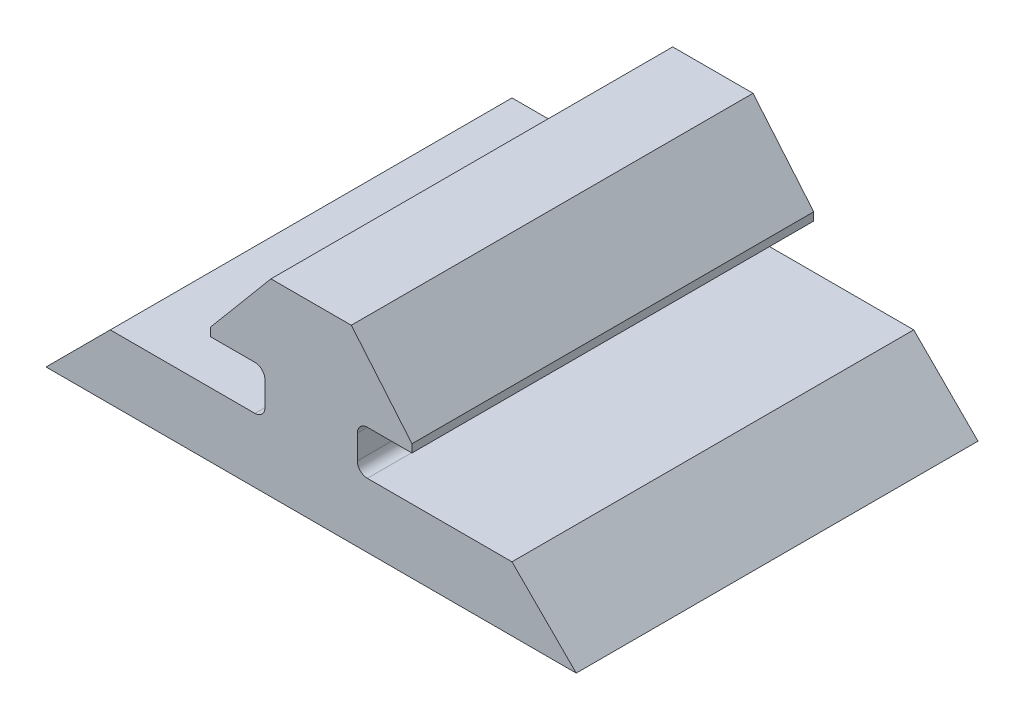
ISO-10303-21;
HEADER;
FILE_DESCRIPTION(('STEP AP214'),'2;1');
FILE_NAME('part.step','',(''),(''),'','','');
FILE_SCHEMA(('AUTOMOTIVE_DESIGN { 1 0 10303 214 1 1 1 1 }'));
ENDSEC;
DATA;
#1=APPLICATION_CONTEXT('core data for automotive mechanical design processes');
#2=APPLICATION_PROTOCOL_DEFINITION('international standard','automotive_design',2000,#1);
#3=PRODUCT_CONTEXT('',#1,'mechanical');
#4=PRODUCT('Part','Part','',(#3));
#5=PRODUCT_RELATED_PRODUCT_CATEGORY('part','',(#4));
#6=PRODUCT_DEFINITION_FORMATION('','',#4);
#7=PRODUCT_DEFINITION_CONTEXT('part definition',#1,'design');
#8=PRODUCT_DEFINITION('design','',#6,#7);
#9=PRODUCT_DEFINITION_SHAPE('','',#8);
#10=(LENGTH_UNIT() NAMED_UNIT(*) SI_UNIT(.MILLI.,.METRE.));
#11=(NAMED_UNIT(*) PLANE_ANGLE_UNIT() SI_UNIT($,.RADIAN.));
#12=(NAMED_UNIT(*) SI_UNIT($,.STERADIAN.) SOLID_ANGLE_UNIT());
#13=UNCERTAINTY_MEASURE_WITH_UNIT(LENGTH_MEASURE(1.E-05),#10,'distance_accuracy_value','');
#14=(GEOMETRIC_REPRESENTATION_CONTEXT(3) GLOBAL_UNCERTAINTY_ASSIGNED_CONTEXT((#13)) GLOBAL_UNIT_ASSIGNED_CONTEXT((#10,
#11,#12)) REPRESENTATION_CONTEXT('',''));
#15=CARTESIAN_POINT('',(0.,0.,0.));
#16=DIRECTION('',(0.,0.,1.));
#17=DIRECTION('',(1.,0.,0.));
#18=AXIS2_PLACEMENT_3D('',#15,#16,#17);
#19=CARTESIAN_POINT('',(12.7,4.064,-3683.));
#20=DIRECTION('',(0.,1.,0.));
#21=DIRECTION('',(0.,0.,1.));
#22=AXIS2_PLACEMENT_3D('',#19,#20,#21);
#23=PLANE('',#22);
#24=DIRECTION('',(1.,0.,0.));
#25=VECTOR('',#24,1.);
#26=CARTESIAN_POINT('',(12.7,4.064,-25.4031625000231));
#27=LINE('',#26,#25);
#28=CARTESIAN_POINT('',(3.556,4.064,-25.4031625000231));
#29=VERTEX_POINT('',#28);
#30=CARTESIAN_POINT('',(12.7,4.064,-25.4031625000229));
#31=VERTEX_POINT('',#30);
#32=EDGE_CURVE('E171',#29,#31,#27,.T.);
#33=ORIENTED_EDGE('',*,*,#32,.F.);
#34=DIRECTION('',(0.,0.,1.));
#35=VECTOR('',#34,1.);
#36=CARTESIAN_POINT('',(3.556,4.064,-3683.));
#37=LINE('',#36,#35);
#38=CARTESIAN_POINT('',(3.556,4.064,0.));
#39=VERTEX_POINT('',#38);
#40=EDGE_CURVE('E46',#29,#39,#37,.T.);
#41=ORIENTED_EDGE('',*,*,#40,.T.);
#42=DIRECTION('',(-1.,0.,0.));
#43=VECTOR('',#42,1.);
#44=CARTESIAN_POINT('',(12.7,4.064,0.));
#45=LINE('',#44,#43);
#46=CARTESIAN_POINT('',(12.7,4.064,0.));
#47=VERTEX_POINT('',#46);
#48=EDGE_CURVE('E53',#47,#39,#45,.T.);
#49=ORIENTED_EDGE('',*,*,#48,.F.);
#50=DIRECTION('',(0.,0.,1.));
#51=VECTOR('',#50,1.);
#52=CARTESIAN_POINT('',(12.7,4.064,-50.8000250000002));
#53=LINE('',#52,#51);
#54=EDGE_CURVE('E193',#31,#47,#53,.T.);
#55=ORIENTED_EDGE('',*,*,#54,.F.);
#56=EDGE_LOOP('',(#33,#41,#49,#55));
#57=FACE_BOUND('',#56,.T.);
#58=ADVANCED_FACE('F43',(#57),#23,.T.);
#59=CARTESIAN_POINT('',(3.55599999999985,4.69899999999985,-3683.));
#60=DIRECTION('',(0.,0.,-1.));
#61=DIRECTION('',(0.707106781186462,0.707106781186633,0.));
#62=AXIS2_PLACEMENT_3D('',#59,#60,#61);
#63=CYLINDRICAL_SURFACE('',#62,0.634999999999855);
#64=ORIENTED_EDGE('',*,*,#40,.F.);
#65=CARTESIAN_POINT('',(3.55599999999985,4.69899999999985,-25.4031625000231));
#66=DIRECTION('',(0.,0.,1.));
#67=DIRECTION('',(1.,0.,0.));
#68=AXIS2_PLACEMENT_3D('',#65,#66,#67);
#69=CIRCLE('',#68,0.634999999999855);
#70=CARTESIAN_POINT('',(2.921,4.69899999999985,-25.4031625000231));
#71=VERTEX_POINT('',#70);
#72=EDGE_CURVE('E471',#29,#71,#69,.F.);
#73=ORIENTED_EDGE('',*,*,#72,.T.);
#74=DIRECTION('',(0.,0.,1.));
#75=VECTOR('',#74,1.);
#76=CARTESIAN_POINT('',(2.921,4.69899999999985,-3683.));
#77=LINE('',#76,#75);
#78=CARTESIAN_POINT('',(2.921,4.69899999999985,0.));
#79=VERTEX_POINT('',#78);
#80=EDGE_CURVE('E272',#71,#79,#77,.T.);
#81=ORIENTED_EDGE('',*,*,#80,.T.);
#82=CARTESIAN_POINT('',(3.55599999999985,4.69899999999985,0.));
#83=DIRECTION('',(0.,0.,1.));
#84=DIRECTION('',(1.,0.,0.));
#85=AXIS2_PLACEMENT_3D('',#82,#83,#84);
#86=CIRCLE('',#85,0.634999999999855);
#87=EDGE_CURVE('E274',#79,#39,#86,.T.);
#88=ORIENTED_EDGE('',*,*,#87,.T.);
#89=EDGE_LOOP('',(#64,#73,#81,#88));
#90=FACE_BOUND('',#89,.T.);
#91=ADVANCED_FACE('F539',(#90),#63,.F.);
#92=CARTESIAN_POINT('',(-12.7,0.,-3683.));
#93=DIRECTION('',(0.,-1.,0.));
#94=DIRECTION('',(0.,0.,-1.));
#95=AXIS2_PLACEMENT_3D('',#92,#93,#94);
#96=PLANE('',#95);
#97=DIRECTION('',(-1.,0.,0.));
#98=VECTOR('',#97,1.);
#99=CARTESIAN_POINT('',(-12.7,0.,-25.4031625000231));
#100=LINE('',#99,#98);
#101=CARTESIAN_POINT('',(16.7640000000001,0.,-25.4031625000229));
#102=VERTEX_POINT('',#101);
#103=CARTESIAN_POINT('',(-16.7639999999999,0.,-25.4031625000229));
#104=VERTEX_POINT('',#103);
#105=EDGE_CURVE('E60',#102,#104,#100,.T.);
#106=ORIENTED_EDGE('',*,*,#105,.F.);
#107=DIRECTION('',(0.,0.,1.));
#108=VECTOR('',#107,1.);
#109=CARTESIAN_POINT('',(16.7640000000001,0.,-50.8000250000002));
#110=LINE('',#109,#108);
#111=CARTESIAN_POINT('',(16.7640000000001,0.,0.));
#112=VERTEX_POINT('',#111);
#113=EDGE_CURVE('E182',#102,#112,#110,.T.);
#114=ORIENTED_EDGE('',*,*,#113,.T.);
#115=DIRECTION('',(1.,0.,0.));
#116=VECTOR('',#115,1.);
#117=CARTESIAN_POINT('',(-12.7,0.,0.));
#118=LINE('',#117,#116);
#119=CARTESIAN_POINT('',(-16.7639999999999,0.,0.));
#120=VERTEX_POINT('',#119);
#121=EDGE_CURVE('E263',#120,#112,#118,.T.);
#122=ORIENTED_EDGE('',*,*,#121,.F.);
#123=DIRECTION('',(0.,0.,1.));
#124=VECTOR('',#123,1.);
#125=CARTESIAN_POINT('',(-16.7639999999999,0.,-50.8063250000458));
#126=LINE('',#125,#124);
#127=EDGE_CURVE('E184',#104,#120,#126,.T.);
#128=ORIENTED_EDGE('',*,*,#127,.F.);
#129=EDGE_LOOP('',(#106,#114,#122,#128));
#130=FACE_BOUND('',#129,.T.);
#131=ADVANCED_FACE('F180',(#130),#96,.T.);
#132=CARTESIAN_POINT('',(3.55599999999985,4.69899999999985,0.));
#133=DIRECTION('',(0.,0.,1.));
#134=DIRECTION('',(1.,0.,0.));
#135=AXIS2_PLACEMENT_3D('',#132,#133,#134);
#136=PLANE('',#135);
#137=ORIENTED_EDGE('',*,*,#121,.T.);
#138=DIRECTION('',(-0.707106781186556,0.707106781186539,0.));
#139=VECTOR('',#138,1.);
#140=CARTESIAN_POINT('',(12.7,4.064,0.));
#141=LINE('',#140,#139);
#142=EDGE_CURVE('E191',#112,#47,#141,.T.);
#143=ORIENTED_EDGE('',*,*,#142,.T.);
#144=ORIENTED_EDGE('',*,*,#48,.T.);
#145=ORIENTED_EDGE('',*,*,#87,.F.);
#146=DIRECTION('',(0.,1.,0.));
#147=VECTOR('',#146,1.);
#148=CARTESIAN_POINT('',(2.921,4.699,0.));
#149=LINE('',#148,#147);
#150=CARTESIAN_POINT('',(2.921,6.223,0.));
#151=VERTEX_POINT('',#150);
#152=EDGE_CURVE('E403',#79,#151,#149,.T.);
#153=ORIENTED_EDGE('',*,*,#152,.T.);
#154=CARTESIAN_POINT('',(3.55599999999985,6.22300000000015,0.));
#155=DIRECTION('',(0.,0.,1.));
#156=DIRECTION('',(1.,0.,0.));
#157=AXIS2_PLACEMENT_3D('',#154,#155,#156);
#158=CIRCLE('',#157,0.634999999999855);
#159=CARTESIAN_POINT('',(3.55599999999985,6.858,0.));
#160=VERTEX_POINT('',#159);
#161=EDGE_CURVE('E397',#160,#151,#158,.T.);
#162=ORIENTED_EDGE('',*,*,#161,.F.);
#163=DIRECTION('',(1.,0.,0.));
#164=VECTOR('',#163,1.);
#165=CARTESIAN_POINT('',(3.556,6.858,0.));
#166=LINE('',#165,#164);
#167=CARTESIAN_POINT('',(6.376363549,6.858,0.));
#168=VERTEX_POINT('',#167);
#169=EDGE_CURVE('E391',#160,#168,#166,.T.);
#170=ORIENTED_EDGE('',*,*,#169,.T.);
#171=DIRECTION('',(0.,1.,0.));
#172=VECTOR('',#171,1.);
#173=CARTESIAN_POINT('',(6.376363549,6.858,0.));
#174=LINE('',#173,#172);
#175=CARTESIAN_POINT('',(6.376363549,7.36599995798179,0.));
#176=VERTEX_POINT('',#175);
#177=EDGE_CURVE('E385',#168,#176,#174,.T.);
#178=ORIENTED_EDGE('',*,*,#177,.T.);
#179=DIRECTION('',(-0.642787609686541,0.766044443118976,0.));
#180=VECTOR('',#179,1.);
#181=CARTESIAN_POINT('',(6.376363549,7.36599995798179,0.));
#182=LINE('',#181,#180);
#183=CARTESIAN_POINT('',(2.54,11.938,0.));
#184=VERTEX_POINT('',#183);
#185=EDGE_CURVE('E379',#176,#184,#182,.T.);
#186=ORIENTED_EDGE('',*,*,#185,.T.);
#187=DIRECTION('',(-1.,0.,0.));
#188=VECTOR('',#187,1.);
#189=CARTESIAN_POINT('',(2.54,11.938,0.));
#190=LINE('',#189,#188);
#191=CARTESIAN_POINT('',(-2.54,11.938,0.));
#192=VERTEX_POINT('',#191);
#193=EDGE_CURVE('E374',#184,#192,#190,.T.);
#194=ORIENTED_EDGE('',*,*,#193,.T.);
#195=DIRECTION('',(-0.642787609686541,-0.766044443118976,0.));
#196=VECTOR('',#195,1.);
#197=CARTESIAN_POINT('',(-2.54,11.938,0.));
#198=LINE('',#197,#196);
#199=CARTESIAN_POINT('',(-6.376363549,7.36599995798179,0.));
#200=VERTEX_POINT('',#199);
#201=EDGE_CURVE('E355',#192,#200,#198,.T.);
#202=ORIENTED_EDGE('',*,*,#201,.T.);
#203=DIRECTION('',(0.,-1.,0.));
#204=VECTOR('',#203,1.);
#205=CARTESIAN_POINT('',(-6.376363549,7.36599995798179,0.));
#206=LINE('',#205,#204);
#207=CARTESIAN_POINT('',(-6.376363549,6.858,0.));
#208=VERTEX_POINT('',#207);
#209=EDGE_CURVE('E348',#200,#208,#206,.T.);
#210=ORIENTED_EDGE('',*,*,#209,.T.);
#211=DIRECTION('',(1.,0.,0.));
#212=VECTOR('',#211,1.);
#213=CARTESIAN_POINT('',(-6.376363549,6.858,0.));
#214=LINE('',#213,#212);
#215=CARTESIAN_POINT('',(-3.556,6.858,0.));
#216=VERTEX_POINT('',#215);
#217=EDGE_CURVE('E352',#208,#216,#214,.T.);
#218=ORIENTED_EDGE('',*,*,#217,.T.);
#219=CARTESIAN_POINT('',(-3.55599999999985,6.22300000000015,0.));
#220=DIRECTION('',(0.,0.,1.));
#221=DIRECTION('',(1.,0.,0.));
#222=AXIS2_PLACEMENT_3D('',#219,#220,#221);
#223=CIRCLE('',#222,0.634999999999855);
#224=CARTESIAN_POINT('',(-2.921,6.22300000000015,0.));
#225=VERTEX_POINT('',#224);
#226=EDGE_CURVE('E360',#225,#216,#223,.T.);
#227=ORIENTED_EDGE('',*,*,#226,.F.);
#228=DIRECTION('',(0.,-1.,0.));
#229=VECTOR('',#228,1.);
#230=CARTESIAN_POINT('',(-2.921,6.223,0.));
#231=LINE('',#230,#229);
#232=CARTESIAN_POINT('',(-2.921,4.699,0.));
#233=VERTEX_POINT('',#232);
#234=EDGE_CURVE('E363',#225,#233,#231,.T.);
#235=ORIENTED_EDGE('',*,*,#234,.T.);
#236=CARTESIAN_POINT('',(-3.55599999999985,4.69899999999985,0.));
#237=DIRECTION('',(0.,0.,1.));
#238=DIRECTION('',(1.,0.,0.));
#239=AXIS2_PLACEMENT_3D('',#236,#237,#238);
#240=CIRCLE('',#239,0.634999999999855);
#241=CARTESIAN_POINT('',(-3.55599999999985,4.064,0.));
#242=VERTEX_POINT('',#241);
#243=EDGE_CURVE('E485',#242,#233,#240,.T.);
#244=ORIENTED_EDGE('',*,*,#243,.F.);
#245=DIRECTION('',(-1.,0.,0.));
#246=VECTOR('',#245,1.);
#247=CARTESIAN_POINT('',(-3.556,4.064,0.));
#248=LINE('',#247,#246);
#249=CARTESIAN_POINT('',(-12.7,4.064,0.));
#250=VERTEX_POINT('',#249);
#251=EDGE_CURVE('E409',#242,#250,#248,.T.);
#252=ORIENTED_EDGE('',*,*,#251,.T.);
#253=DIRECTION('',(-0.707106781186541,-0.707106781186554,0.));
#254=VECTOR('',#253,1.);
#255=CARTESIAN_POINT('',(-12.7,4.064,0.));
#256=LINE('',#255,#254);
#257=EDGE_CURVE('E429',#250,#120,#256,.T.);
#258=ORIENTED_EDGE('',*,*,#257,.T.);
#259=EDGE_LOOP('',(#137,#143,#144,#145,#153,#162,#170,#178,#186,#194,#202,#210,#218,#227,#235,
#244,#252,#258));
#260=FACE_BOUND('',#259,.T.);
#261=ADVANCED_FACE('F351',(#260),#136,.T.);
#262=CARTESIAN_POINT('',(-3.55599999999985,4.69899999999985,-3683.));
#263=DIRECTION('',(0.,0.,-1.));
#264=DIRECTION('',(-0.707106781186648,0.707106781186447,0.));
#265=AXIS2_PLACEMENT_3D('',#262,#263,#264);
#266=CYLINDRICAL_SURFACE('',#265,0.634999999999855);
#267=DIRECTION('',(0.,0.,1.));
#268=VECTOR('',#267,1.);
#269=CARTESIAN_POINT('',(-2.921,4.699,-3683.));
#270=LINE('',#269,#268);
#271=CARTESIAN_POINT('',(-2.921,4.699,-25.4031625000231));
#272=VERTEX_POINT('',#271);
#273=EDGE_CURVE('E324',#272,#233,#270,.T.);
#274=ORIENTED_EDGE('',*,*,#273,.F.);
#275=CARTESIAN_POINT('',(-3.55599999999985,4.69899999999985,-25.4031625000231));
#276=DIRECTION('',(0.,0.,1.));
#277=DIRECTION('',(1.,0.,0.));
#278=AXIS2_PLACEMENT_3D('',#275,#276,#277);
#279=CIRCLE('',#278,0.634999999999855);
#280=CARTESIAN_POINT('',(-3.55599999999985,4.064,-25.4031625000231));
#281=VERTEX_POINT('',#280);
#282=EDGE_CURVE('E186',#272,#281,#279,.F.);
#283=ORIENTED_EDGE('',*,*,#282,.T.);
#284=DIRECTION('',(0.,0.,1.));
#285=VECTOR('',#284,1.);
#286=CARTESIAN_POINT('',(-3.55599999999985,4.064,-3683.));
#287=LINE('',#286,#285);
#288=EDGE_CURVE('E326',#281,#242,#287,.T.);
#289=ORIENTED_EDGE('',*,*,#288,.T.);
#290=ORIENTED_EDGE('',*,*,#243,.T.);
#291=EDGE_LOOP('',(#274,#283,#289,#290));
#292=FACE_BOUND('',#291,.T.);
#293=ADVANCED_FACE('F496',(#292),#266,.F.);
#294=CARTESIAN_POINT('',(-2.921,6.223,-3683.));
#295=DIRECTION('',(-1.,0.,0.));
#296=DIRECTION('',(0.,0.,1.));
#297=AXIS2_PLACEMENT_3D('',#294,#295,#296);
#298=PLANE('',#297);
#299=DIRECTION('',(0.,1.,0.));
#300=VECTOR('',#299,1.);
#301=CARTESIAN_POINT('',(-2.921,6.223,-25.4031625000231));
#302=LINE('',#301,#300);
#303=CARTESIAN_POINT('',(-2.921,6.22300000000015,-25.4031625000231));
#304=VERTEX_POINT('',#303);
#305=EDGE_CURVE('E176',#272,#304,#302,.T.);
#306=ORIENTED_EDGE('',*,*,#305,.F.);
#307=ORIENTED_EDGE('',*,*,#273,.T.);
#308=ORIENTED_EDGE('',*,*,#234,.F.);
#309=DIRECTION('',(0.,0.,1.));
#310=VECTOR('',#309,1.);
#311=CARTESIAN_POINT('',(-2.921,6.22300000000015,-3683.));
#312=LINE('',#311,#310);
#313=EDGE_CURVE('E327',#304,#225,#312,.T.);
#314=ORIENTED_EDGE('',*,*,#313,.F.);
#315=EDGE_LOOP('',(#306,#307,#308,#314));
#316=FACE_BOUND('',#315,.T.);
#317=ADVANCED_FACE('F479',(#316),#298,.T.);
#318=CARTESIAN_POINT('',(-3.55599999999985,6.22300000000015,-3683.));
#319=DIRECTION('',(0.,0.,-1.));
#320=DIRECTION('',(-0.707106781186462,-0.707106781186633,0.));
#321=AXIS2_PLACEMENT_3D('',#318,#319,#320);
#322=CYLINDRICAL_SURFACE('',#321,0.634999999999855);
#323=DIRECTION('',(0.,0.,1.));
#324=VECTOR('',#323,1.);
#325=CARTESIAN_POINT('',(-3.556,6.858,-3683.));
#326=LINE('',#325,#324);
#327=CARTESIAN_POINT('',(-3.556,6.858,-25.4031625000231));
#328=VERTEX_POINT('',#327);
#329=EDGE_CURVE('E316',#328,#216,#326,.T.);
#330=ORIENTED_EDGE('',*,*,#329,.F.);
#331=CARTESIAN_POINT('',(-3.55599999999985,6.22300000000015,-25.4031625000231));
#332=DIRECTION('',(0.,0.,1.));
#333=DIRECTION('',(1.,0.,0.));
#334=AXIS2_PLACEMENT_3D('',#331,#332,#333);
#335=CIRCLE('',#334,0.634999999999855);
#336=EDGE_CURVE('E223',#328,#304,#335,.F.);
#337=ORIENTED_EDGE('',*,*,#336,.T.);
#338=ORIENTED_EDGE('',*,*,#313,.T.);
#339=ORIENTED_EDGE('',*,*,#226,.T.);
#340=EDGE_LOOP('',(#330,#337,#338,#339));
#341=FACE_BOUND('',#340,.T.);
#342=ADVANCED_FACE('F475',(#341),#322,.F.);
#343=CARTESIAN_POINT('',(-6.376363549,6.858,-3683.));
#344=DIRECTION('',(0.,-1.,0.));
#345=DIRECTION('',(0.,0.,-1.));
#346=AXIS2_PLACEMENT_3D('',#343,#344,#345);
#347=PLANE('',#346);
#348=DIRECTION('',(-1.,0.,0.));
#349=VECTOR('',#348,1.);
#350=CARTESIAN_POINT('',(-6.376363549,6.858,-25.4031625000231));
#351=LINE('',#350,#349);
#352=CARTESIAN_POINT('',(-6.376363549,6.858,-25.4031625000231));
#353=VERTEX_POINT('',#352);
#354=EDGE_CURVE('E425',#328,#353,#351,.T.);
#355=ORIENTED_EDGE('',*,*,#354,.F.);
#356=ORIENTED_EDGE('',*,*,#329,.T.);
#357=ORIENTED_EDGE('',*,*,#217,.F.);
#358=DIRECTION('',(0.,0.,1.));
#359=VECTOR('',#358,1.);
#360=CARTESIAN_POINT('',(-6.376363549,6.858,-3683.));
#361=LINE('',#360,#359);
#362=EDGE_CURVE('E306',#353,#208,#361,.T.);
#363=ORIENTED_EDGE('',*,*,#362,.F.);
#364=EDGE_LOOP('',(#355,#356,#357,#363));
#365=FACE_BOUND('',#364,.T.);
#366=ADVANCED_FACE('F358',(#365),#347,.T.);
#367=CARTESIAN_POINT('',(-6.376363549,7.36599995798179,-3683.));
#368=DIRECTION('',(-1.,0.,0.));
#369=DIRECTION('',(0.,0.,1.));
#370=AXIS2_PLACEMENT_3D('',#367,#368,#369);
#371=PLANE('',#370);
#372=DIRECTION('',(0.,1.,0.));
#373=VECTOR('',#372,1.);
#374=CARTESIAN_POINT('',(-6.376363549,7.36599995798179,-25.4031625000231));
#375=LINE('',#374,#373);
#376=CARTESIAN_POINT('',(-6.376363549,7.36599995798179,-25.4031625000231));
#377=VERTEX_POINT('',#376);
#378=EDGE_CURVE('E349',#353,#377,#375,.T.);
#379=ORIENTED_EDGE('',*,*,#378,.F.);
#380=ORIENTED_EDGE('',*,*,#362,.T.);
#381=ORIENTED_EDGE('',*,*,#209,.F.);
#382=DIRECTION('',(0.,0.,1.));
#383=VECTOR('',#382,1.);
#384=CARTESIAN_POINT('',(-6.376363549,7.36599995798179,-3683.));
#385=LINE('',#384,#383);
#386=EDGE_CURVE('E303',#377,#200,#385,.T.);
#387=ORIENTED_EDGE('',*,*,#386,.F.);
#388=EDGE_LOOP('',(#379,#380,#381,#387));
#389=FACE_BOUND('',#388,.T.);
#390=ADVANCED_FACE('F346',(#389),#371,.T.);
#391=CARTESIAN_POINT('',(-2.54,11.938,-3683.));
#392=DIRECTION('',(-0.766044443118977,0.642787609686541,0.));
#393=DIRECTION('',(-0.642787609686541,-0.766044443118977,0.));
#394=AXIS2_PLACEMENT_3D('',#391,#392,#393);
#395=PLANE('',#394);
#396=DIRECTION('',(0.642787609686541,0.766044443118977,0.));
#397=VECTOR('',#396,1.);
#398=CARTESIAN_POINT('',(-2.54,11.938,-25.4031625000231));
#399=LINE('',#398,#397);
#400=CARTESIAN_POINT('',(-2.54,11.938,-25.4031625000231));
#401=VERTEX_POINT('',#400);
#402=EDGE_CURVE('E439',#377,#401,#399,.T.);
#403=ORIENTED_EDGE('',*,*,#402,.F.);
#404=ORIENTED_EDGE('',*,*,#386,.T.);
#405=ORIENTED_EDGE('',*,*,#201,.F.);
#406=DIRECTION('',(0.,0.,1.));
#407=VECTOR('',#406,1.);
#408=CARTESIAN_POINT('',(-2.54,11.938,-3683.));
#409=LINE('',#408,#407);
#410=EDGE_CURVE('E300',#401,#192,#409,.T.);
#411=ORIENTED_EDGE('',*,*,#410,.F.);
#412=EDGE_LOOP('',(#403,#404,#405,#411));
#413=FACE_BOUND('',#412,.T.);
#414=ADVANCED_FACE('F558',(#413),#395,.T.);
#415=CARTESIAN_POINT('',(2.54,11.938,-3683.));
#416=DIRECTION('',(0.,1.,0.));
#417=DIRECTION('',(0.,0.,1.));
#418=AXIS2_PLACEMENT_3D('',#415,#416,#417);
#419=PLANE('',#418);
#420=DIRECTION('',(1.,0.,0.));
#421=VECTOR('',#420,1.);
#422=CARTESIAN_POINT('',(2.54,11.938,-25.4031625000231));
#423=LINE('',#422,#421);
#424=CARTESIAN_POINT('',(2.54,11.938,-25.4031625000231));
#425=VERTEX_POINT('',#424);
#426=EDGE_CURVE('E442',#401,#425,#423,.T.);
#427=ORIENTED_EDGE('',*,*,#426,.F.);
#428=ORIENTED_EDGE('',*,*,#410,.T.);
#429=ORIENTED_EDGE('',*,*,#193,.F.);
#430=DIRECTION('',(0.,0.,1.));
#431=VECTOR('',#430,1.);
#432=CARTESIAN_POINT('',(2.54,11.938,-3683.));
#433=LINE('',#432,#431);
#434=EDGE_CURVE('E297',#425,#184,#433,.T.);
#435=ORIENTED_EDGE('',*,*,#434,.F.);
#436=EDGE_LOOP('',(#427,#428,#429,#435));
#437=FACE_BOUND('',#436,.T.);
#438=ADVANCED_FACE('F561',(#437),#419,.T.);
#439=CARTESIAN_POINT('',(6.376363549,7.36599995798179,-3683.));
#440=DIRECTION('',(0.766044443118977,0.642787609686541,0.));
#441=DIRECTION('',(-0.642787609686541,0.766044443118977,0.));
#442=AXIS2_PLACEMENT_3D('',#439,#440,#441);
#443=PLANE('',#442);
#444=DIRECTION('',(0.642787609686541,-0.766044443118977,0.));
#445=VECTOR('',#444,1.);
#446=CARTESIAN_POINT('',(6.376363549,7.36599995798179,-25.4031625000231));
#447=LINE('',#446,#445);
#448=CARTESIAN_POINT('',(6.376363549,7.36599995798179,-25.4031625000231));
#449=VERTEX_POINT('',#448);
#450=EDGE_CURVE('E451',#425,#449,#447,.T.);
#451=ORIENTED_EDGE('',*,*,#450,.F.);
#452=ORIENTED_EDGE('',*,*,#434,.T.);
#453=ORIENTED_EDGE('',*,*,#185,.F.);
#454=DIRECTION('',(0.,0.,1.));
#455=VECTOR('',#454,1.);
#456=CARTESIAN_POINT('',(6.376363549,7.36599995798179,-3683.));
#457=LINE('',#456,#455);
#458=EDGE_CURVE('E287',#449,#176,#457,.T.);
#459=ORIENTED_EDGE('',*,*,#458,.F.);
#460=EDGE_LOOP('',(#451,#452,#453,#459));
#461=FACE_BOUND('',#460,.T.);
#462=ADVANCED_FACE('F565',(#461),#443,.T.);
#463=CARTESIAN_POINT('',(6.376363549,6.858,-3683.));
#464=DIRECTION('',(1.,0.,0.));
#465=DIRECTION('',(0.,0.,-1.));
#466=AXIS2_PLACEMENT_3D('',#463,#464,#465);
#467=PLANE('',#466);
#468=DIRECTION('',(0.,-1.,0.));
#469=VECTOR('',#468,1.);
#470=CARTESIAN_POINT('',(6.376363549,6.858,-25.4031625000231));
#471=LINE('',#470,#469);
#472=CARTESIAN_POINT('',(6.376363549,6.858,-25.4031625000231));
#473=VERTEX_POINT('',#472);
#474=EDGE_CURVE('E454',#449,#473,#471,.T.);
#475=ORIENTED_EDGE('',*,*,#474,.F.);
#476=ORIENTED_EDGE('',*,*,#458,.T.);
#477=ORIENTED_EDGE('',*,*,#177,.F.);
#478=DIRECTION('',(0.,0.,1.));
#479=VECTOR('',#478,1.);
#480=CARTESIAN_POINT('',(6.376363549,6.858,-3683.));
#481=LINE('',#480,#479);
#482=EDGE_CURVE('E284',#473,#168,#481,.T.);
#483=ORIENTED_EDGE('',*,*,#482,.F.);
#484=EDGE_LOOP('',(#475,#476,#477,#483));
#485=FACE_BOUND('',#484,.T.);
#486=ADVANCED_FACE('F530',(#485),#467,.T.);
#487=CARTESIAN_POINT('',(3.556,6.858,-3683.));
#488=DIRECTION('',(0.,-1.,0.));
#489=DIRECTION('',(0.,0.,-1.));
#490=AXIS2_PLACEMENT_3D('',#487,#488,#489);
#491=PLANE('',#490);
#492=DIRECTION('',(-1.,0.,0.));
#493=VECTOR('',#492,1.);
#494=CARTESIAN_POINT('',(3.556,6.858,-25.4031625000231));
#495=LINE('',#494,#493);
#496=CARTESIAN_POINT('',(3.55599999999985,6.858,-25.4031625000231));
#497=VERTEX_POINT('',#496);
#498=EDGE_CURVE('E462',#473,#497,#495,.T.);
#499=ORIENTED_EDGE('',*,*,#498,.F.);
#500=ORIENTED_EDGE('',*,*,#482,.T.);
#501=ORIENTED_EDGE('',*,*,#169,.F.);
#502=DIRECTION('',(0.,0.,1.));
#503=VECTOR('',#502,1.);
#504=CARTESIAN_POINT('',(3.55599999999985,6.858,-3683.));
#505=LINE('',#504,#503);
#506=EDGE_CURVE('E281',#497,#160,#505,.T.);
#507=ORIENTED_EDGE('',*,*,#506,.F.);
#508=EDGE_LOOP('',(#499,#500,#501,#507));
#509=FACE_BOUND('',#508,.T.);
#510=ADVANCED_FACE('F524',(#509),#491,.T.);
#511=CARTESIAN_POINT('',(3.55599999999985,6.22300000000015,-3683.));
#512=DIRECTION('',(0.,0.,-1.));
#513=DIRECTION('',(0.707106781186632,-0.707106781186463,0.));
#514=AXIS2_PLACEMENT_3D('',#511,#512,#513);
#515=CYLINDRICAL_SURFACE('',#514,0.634999999999855);
#516=DIRECTION('',(0.,0.,1.));
#517=VECTOR('',#516,1.);
#518=CARTESIAN_POINT('',(2.921,6.223,-3683.));
#519=LINE('',#518,#517);
#520=CARTESIAN_POINT('',(2.921,6.223,-25.4031625000231));
#521=VERTEX_POINT('',#520);
#522=EDGE_CURVE('E208',#521,#151,#519,.T.);
#523=ORIENTED_EDGE('',*,*,#522,.F.);
#524=CARTESIAN_POINT('',(3.55599999999985,6.22300000000015,-25.4031625000231));
#525=DIRECTION('',(0.,0.,1.));
#526=DIRECTION('',(1.,0.,0.));
#527=AXIS2_PLACEMENT_3D('',#524,#525,#526);
#528=CIRCLE('',#527,0.634999999999855);
#529=EDGE_CURVE('E466',#521,#497,#528,.F.);
#530=ORIENTED_EDGE('',*,*,#529,.T.);
#531=ORIENTED_EDGE('',*,*,#506,.T.);
#532=ORIENTED_EDGE('',*,*,#161,.T.);
#533=EDGE_LOOP('',(#523,#530,#531,#532));
#534=FACE_BOUND('',#533,.T.);
#535=ADVANCED_FACE('F518',(#534),#515,.F.);
#536=CARTESIAN_POINT('',(2.921,4.699,-3683.));
#537=DIRECTION('',(1.,0.,0.));
#538=DIRECTION('',(0.,0.,-1.));
#539=AXIS2_PLACEMENT_3D('',#536,#537,#538);
#540=PLANE('',#539);
#541=DIRECTION('',(0.,-1.,0.));
#542=VECTOR('',#541,1.);
#543=CARTESIAN_POINT('',(2.921,4.699,-25.4031625000231));
#544=LINE('',#543,#542);
#545=EDGE_CURVE('E468',#521,#71,#544,.T.);
#546=ORIENTED_EDGE('',*,*,#545,.F.);
#547=ORIENTED_EDGE('',*,*,#522,.T.);
#548=ORIENTED_EDGE('',*,*,#152,.F.);
#549=ORIENTED_EDGE('',*,*,#80,.F.);
#550=EDGE_LOOP('',(#546,#547,#548,#549));
#551=FACE_BOUND('',#550,.T.);
#552=ADVANCED_FACE('F538',(#551),#540,.T.);
#553=CARTESIAN_POINT('',(-3.556,4.064,-3683.));
#554=DIRECTION('',(0.,1.,0.));
#555=DIRECTION('',(0.,0.,1.));
#556=AXIS2_PLACEMENT_3D('',#553,#554,#555);
#557=PLANE('',#556);
#558=DIRECTION('',(1.,0.,0.));
#559=VECTOR('',#558,1.);
#560=CARTESIAN_POINT('',(-3.556,4.064,-25.4031625000231));
#561=LINE('',#560,#559);
#562=CARTESIAN_POINT('',(-12.7,4.064,-25.4031625000229));
#563=VERTEX_POINT('',#562);
#564=EDGE_CURVE('E504',#563,#281,#561,.T.);
#565=ORIENTED_EDGE('',*,*,#564,.F.);
#566=DIRECTION('',(0.,0.,1.));
#567=VECTOR('',#566,1.);
#568=CARTESIAN_POINT('',(-12.7,4.064,-50.8000250000002));
#569=LINE('',#568,#567);
#570=EDGE_CURVE('E197',#563,#250,#569,.T.);
#571=ORIENTED_EDGE('',*,*,#570,.T.);
#572=ORIENTED_EDGE('',*,*,#251,.F.);
#573=ORIENTED_EDGE('',*,*,#288,.F.);
#574=EDGE_LOOP('',(#565,#571,#572,#573));
#575=FACE_BOUND('',#574,.T.);
#576=ADVANCED_FACE('F501',(#575),#557,.T.);
#577=CARTESIAN_POINT('',(12.7,4.064,-50.8000250000002));
#578=DIRECTION('',(0.707106781186539,0.707106781186556,0.));
#579=DIRECTION('',(-0.707106781186556,0.707106781186539,0.));
#580=AXIS2_PLACEMENT_3D('',#577,#578,#579);
#581=PLANE('',#580);
#582=DIRECTION('',(0.707106781186556,-0.707106781186539,0.));
#583=VECTOR('',#582,1.);
#584=CARTESIAN_POINT('',(12.7,4.064,-25.4031625000229));
#585=LINE('',#584,#583);
#586=EDGE_CURVE('E169',#31,#102,#585,.T.);
#587=ORIENTED_EDGE('',*,*,#586,.F.);
#588=ORIENTED_EDGE('',*,*,#54,.T.);
#589=ORIENTED_EDGE('',*,*,#142,.F.);
#590=ORIENTED_EDGE('',*,*,#113,.F.);
#591=EDGE_LOOP('',(#587,#588,#589,#590));
#592=FACE_BOUND('',#591,.T.);
#593=ADVANCED_FACE('F189',(#592),#581,.T.);
#594=CARTESIAN_POINT('',(-12.7,4.064,-50.8063250000458));
#595=DIRECTION('',(-0.707106781186554,0.707106781186541,0.));
#596=DIRECTION('',(-0.707106781186541,-0.707106781186554,0.));
#597=AXIS2_PLACEMENT_3D('',#594,#595,#596);
#598=PLANE('',#597);
#599=DIRECTION('',(0.707106781186541,0.707106781186554,0.));
#600=VECTOR('',#599,1.);
#601=CARTESIAN_POINT('',(-12.7,4.064,-25.4031625000229));
#602=LINE('',#601,#600);
#603=EDGE_CURVE('E12',#104,#563,#602,.T.);
#604=ORIENTED_EDGE('',*,*,#603,.F.);
#605=ORIENTED_EDGE('',*,*,#127,.T.);
#606=ORIENTED_EDGE('',*,*,#257,.F.);
#607=ORIENTED_EDGE('',*,*,#570,.F.);
#608=EDGE_LOOP('',(#604,#605,#606,#607));
#609=FACE_BOUND('',#608,.T.);
#610=ADVANCED_FACE('F507',(#609),#598,.T.);
#611=CARTESIAN_POINT('',(16.7640000000001,11.93805,-25.4031625000229));
#612=DIRECTION('',(0.,0.,1.));
#613=DIRECTION('',(1.,0.,0.));
#614=AXIS2_PLACEMENT_3D('',#611,#612,#613);
#615=PLANE('',#614);
#616=ORIENTED_EDGE('',*,*,#354,.T.);
#617=ORIENTED_EDGE('',*,*,#378,.T.);
#618=ORIENTED_EDGE('',*,*,#402,.T.);
#619=ORIENTED_EDGE('',*,*,#426,.T.);
#620=ORIENTED_EDGE('',*,*,#450,.T.);
#621=ORIENTED_EDGE('',*,*,#474,.T.);
#622=ORIENTED_EDGE('',*,*,#498,.T.);
#623=ORIENTED_EDGE('',*,*,#529,.F.);
#624=ORIENTED_EDGE('',*,*,#545,.T.);
#625=ORIENTED_EDGE('',*,*,#72,.F.);
#626=ORIENTED_EDGE('',*,*,#32,.T.);
#627=ORIENTED_EDGE('',*,*,#586,.T.);
#628=ORIENTED_EDGE('',*,*,#105,.T.);
#629=ORIENTED_EDGE('',*,*,#603,.T.);
#630=ORIENTED_EDGE('',*,*,#564,.T.);
#631=ORIENTED_EDGE('',*,*,#282,.F.);
#632=ORIENTED_EDGE('',*,*,#305,.T.);
#633=ORIENTED_EDGE('',*,*,#336,.F.);
#634=EDGE_LOOP('',(#616,#617,#618,#619,#620,#621,#622,#623,#624,#625,#626,#627,#628,#629,#630,
#631,#632,#633));
#635=FACE_BOUND('',#634,.T.);
#636=ADVANCED_FACE('F170',(#635),#615,.F.);
#637=CLOSED_SHELL('',(#58,#91,#131,#261,#293,#317,#342,#366,#390,#414,#438,#462,#486,#510,#535,
#552,#576,#593,#610,#636));
#638=MANIFOLD_SOLID_BREP('B2',#637);
#639=ADVANCED_BREP_SHAPE_REPRESENTATION('',(#18,#638),#14);
#640=SHAPE_DEFINITION_REPRESENTATION(#9,#639);
ENDSEC;
END-ISO-10303-21;
